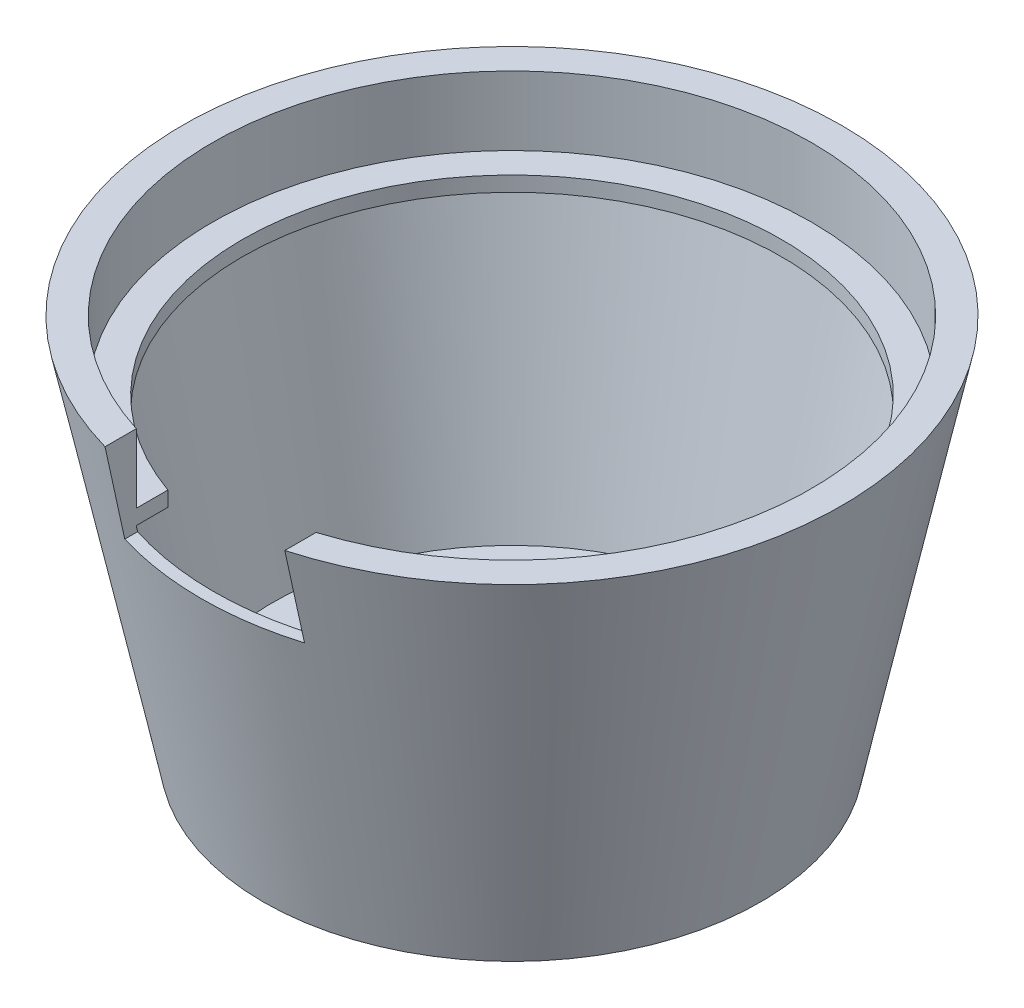
ISO-10303-21;
HEADER;
FILE_DESCRIPTION(('STEP AP214'),'2;1');
FILE_NAME('part.step','',(''),(''),'','','');
FILE_SCHEMA(('AUTOMOTIVE_DESIGN { 1 0 10303 214 1 1 1 1 }'));
ENDSEC;
DATA;
#1=APPLICATION_CONTEXT('core data for automotive mechanical design processes');
#2=APPLICATION_PROTOCOL_DEFINITION('international standard','automotive_design',2000,#1);
#3=PRODUCT_CONTEXT('',#1,'mechanical');
#4=PRODUCT('Part','Part','',(#3));
#5=PRODUCT_RELATED_PRODUCT_CATEGORY('part','',(#4));
#6=PRODUCT_DEFINITION_FORMATION('','',#4);
#7=PRODUCT_DEFINITION_CONTEXT('part definition',#1,'design');
#8=PRODUCT_DEFINITION('design','',#6,#7);
#9=PRODUCT_DEFINITION_SHAPE('','',#8);
#10=(LENGTH_UNIT() NAMED_UNIT(*) SI_UNIT(.MILLI.,.METRE.));
#11=(NAMED_UNIT(*) PLANE_ANGLE_UNIT() SI_UNIT($,.RADIAN.));
#12=(NAMED_UNIT(*) SI_UNIT($,.STERADIAN.) SOLID_ANGLE_UNIT());
#13=UNCERTAINTY_MEASURE_WITH_UNIT(LENGTH_MEASURE(1.E-05),#10,'distance_accuracy_value','');
#14=(GEOMETRIC_REPRESENTATION_CONTEXT(3) GLOBAL_UNCERTAINTY_ASSIGNED_CONTEXT((#13)) GLOBAL_UNIT_ASSIGNED_CONTEXT((#10,
#11,#12)) REPRESENTATION_CONTEXT('',''));
#15=CARTESIAN_POINT('',(0.,0.,0.));
#16=DIRECTION('',(0.,0.,1.));
#17=DIRECTION('',(1.,0.,0.));
#18=AXIS2_PLACEMENT_3D('',#15,#16,#17);
#19=CARTESIAN_POINT('',(0.,0.,0.));
#20=DIRECTION('',(0.,1.,0.));
#21=DIRECTION('',(0.,0.,1.));
#22=AXIS2_PLACEMENT_3D('',#19,#20,#21);
#23=PLANE('',#22);
#24=CARTESIAN_POINT('',(0.,0.,0.));
#25=DIRECTION('',(0.,1.,0.));
#26=DIRECTION('',(0.,0.,1.));
#27=AXIS2_PLACEMENT_3D('',#24,#25,#26);
#28=CIRCLE('',#27,83.0344571751672);
#29=CARTESIAN_POINT('',(0.,0.,83.0344571751672));
#30=VERTEX_POINT('',#29);
#31=EDGE_CURVE('E108',#30,#30,#28,.T.);
#32=ORIENTED_EDGE('',*,*,#31,.F.);
#33=EDGE_LOOP('',(#32));
#34=FACE_BOUND('',#33,.T.);
#35=ADVANCED_FACE('F33',(#34),#23,.F.);
#36=CARTESIAN_POINT('',(0.,0.,0.));
#37=DIRECTION('',(0.,1.,0.));
#38=DIRECTION('',(0.,0.,1.));
#39=AXIS2_PLACEMENT_3D('',#36,#37,#38);
#40=CONICAL_SURFACE('',#39,83.0344571751672,0.207632184076368);
#41=CARTESIAN_POINT('',(0.,98.,0.));
#42=DIRECTION('',(0.,1.,0.));
#43=DIRECTION('',(0.,0.,1.));
#44=AXIS2_PLACEMENT_3D('',#41,#42,#43);
#45=CIRCLE('',#44,103.67995090043);
#46=CARTESIAN_POINT('',(-30.,98.,99.2448095303504));
#47=VERTEX_POINT('',#46);
#48=CARTESIAN_POINT('',(30.,98.,99.2448095303504));
#49=VERTEX_POINT('',#48);
#50=EDGE_CURVE('E201',#47,#49,#45,.T.);
#51=ORIENTED_EDGE('',*,*,#50,.F.);
#52=CARTESIAN_POINT('',(-30.,11.1467842911483,79.9387941229223));
#53=CARTESIAN_POINT('',(-30.,15.0234413229523,80.8110948281733));
#54=CARTESIAN_POINT('',(-30.,18.9004729747379,81.6817290717428));
#55=CARTESIAN_POINT('',(-30.,26.6552200028053,83.4199451865092));
#56=CARTESIAN_POINT('',(-30.,30.5329353790032,84.2875270580805));
#57=CARTESIAN_POINT('',(-30.,42.1670052918576,86.8861141545615));
#58=CARTESIAN_POINT('',(-30.,49.9242885667875,88.6129619752041));
#59=CARTESIAN_POINT('',(-30.,65.4408911336463,92.0573601411311));
#60=CARTESIAN_POINT('',(-30.,73.2002104187839,93.774910517025));
#61=CARTESIAN_POINT('',(-30.,88.7205901537062,97.2021311658331));
#62=CARTESIAN_POINT('',(-30.,96.4816506037949,98.9118014373709));
#63=CARTESIAN_POINT('',(-30.,112.005238018175,102.32439643821));
#64=CARTESIAN_POINT('',(-30.,119.767764979545,104.0273211808));
#65=CARTESIAN_POINT('',(-30.,135.294092604152,107.427352063947));
#66=CARTESIAN_POINT('',(-30.,143.057893267344,109.124458204706));
#67=CARTESIAN_POINT('',(-30.,158.586623026695,112.513624846633));
#68=CARTESIAN_POINT('',(-30.,166.351552126569,114.205685330773));
#69=CARTESIAN_POINT('',(-30.,181.882375979694,117.585365611172));
#70=CARTESIAN_POINT('',(-30.,189.648270732854,119.272985407841));
#71=CARTESIAN_POINT('',(-30.,197.414580721871,120.958690365785));
#72=B_SPLINE_CURVE_WITH_KNOTS('',3,(#52,#53,#54,#55,#56,#57,#58,#59,#60,#61,#62,#63,#64,#65,#66,
#67,#68,#69,#70,#71),.UNSPECIFIED.,.F.,.F.,(4,2,2,2,2,2,2,2,2,4),(0.,11.9207542680957,
23.8415070742664,47.6829974534868,71.5244092927286,95.3658252963549,119.207194307158,
143.048562487092,166.890011030567,190.731457373112),.UNSPECIFIED.);
#73=CARTESIAN_POINT('',(-30.,128.,105.830052442584));
#74=VERTEX_POINT('',#73);
#75=EDGE_CURVE('E113',#47,#74,#72,.T.);
#76=ORIENTED_EDGE('',*,*,#75,.T.);
#77=CARTESIAN_POINT('',(0.,128.,0.));
#78=DIRECTION('',(0.,1.,0.));
#79=DIRECTION('',(0.,0.,1.));
#80=AXIS2_PLACEMENT_3D('',#77,#78,#79);
#81=CIRCLE('',#80,110.);
#82=CARTESIAN_POINT('',(30.,128.,105.830052442584));
#83=VERTEX_POINT('',#82);
#84=EDGE_CURVE('E141',#83,#74,#81,.T.);
#85=ORIENTED_EDGE('',*,*,#84,.F.);
#86=CARTESIAN_POINT('',(30.,197.414580721871,120.958690365785));
#87=CARTESIAN_POINT('',(30.,189.648270732854,119.272985407841));
#88=CARTESIAN_POINT('',(30.,181.882375979694,117.585365611172));
#89=CARTESIAN_POINT('',(30.,166.351552126569,114.205685330773));
#90=CARTESIAN_POINT('',(30.,158.586623026695,112.513624846633));
#91=CARTESIAN_POINT('',(30.,143.057893267344,109.124458204706));
#92=CARTESIAN_POINT('',(30.,135.294092604152,107.427352063947));
#93=CARTESIAN_POINT('',(30.,119.767764979545,104.0273211808));
#94=CARTESIAN_POINT('',(30.,112.005238018175,102.32439643821));
#95=CARTESIAN_POINT('',(30.,96.4816506037949,98.9118014373709));
#96=CARTESIAN_POINT('',(30.,88.7205901537062,97.2021311658331));
#97=CARTESIAN_POINT('',(30.,73.2002104187839,93.774910517025));
#98=CARTESIAN_POINT('',(30.,65.4408911336463,92.0573601411311));
#99=CARTESIAN_POINT('',(30.,49.9242885667875,88.6129619752041));
#100=CARTESIAN_POINT('',(30.,42.1670052918576,86.8861141545615));
#101=CARTESIAN_POINT('',(30.,30.5329353790032,84.2875270580805));
#102=CARTESIAN_POINT('',(30.,26.6552200028053,83.4199451865092));
#103=CARTESIAN_POINT('',(30.,18.9004729747379,81.6817290717428));
#104=CARTESIAN_POINT('',(30.,15.0234413229523,80.8110948281733));
#105=CARTESIAN_POINT('',(30.,11.1467842911483,79.9387941229223));
#106=B_SPLINE_CURVE_WITH_KNOTS('',3,(#86,#87,#88,#89,#90,#91,#92,#93,#94,#95,#96,#97,#98,#99,
#100,#101,#102,#103,#104,#105),.UNSPECIFIED.,.F.,.F.,(4,2,2,2,2,2,2,2,2,4),(0.,23.8414463425452,
47.6828948860206,71.5242630659545,95.3656320767573,119.207048080384,143.048459919625,
166.889950298846,178.810703105017,190.731457373112),.UNSPECIFIED.);
#107=EDGE_CURVE('E160',#83,#49,#106,.T.);
#108=ORIENTED_EDGE('',*,*,#107,.T.);
#109=EDGE_LOOP('',(#51,#76,#85,#108));
#110=FACE_BOUND('',#109,.T.);
#111=ORIENTED_EDGE('',*,*,#31,.T.);
#112=EDGE_LOOP('',(#111));
#113=FACE_BOUND('',#112,.T.);
#114=ADVANCED_FACE('F171',(#110,#113),#40,.T.);
#115=CARTESIAN_POINT('',(0.,128.,-110.));
#116=DIRECTION('',(0.,-1.,0.));
#117=DIRECTION('',(0.,0.,-1.));
#118=AXIS2_PLACEMENT_3D('',#115,#116,#117);
#119=PLANE('',#118);
#120=ORIENTED_EDGE('',*,*,#84,.T.);
#121=DIRECTION('',(0.,0.,1.));
#122=VECTOR('',#121,1.);
#123=CARTESIAN_POINT('',(-30.,128.,69.8146177251522));
#124=LINE('',#123,#122);
#125=CARTESIAN_POINT('',(-30.,128.,95.3939201416945));
#126=VERTEX_POINT('',#125);
#127=EDGE_CURVE('E206',#126,#74,#124,.T.);
#128=ORIENTED_EDGE('',*,*,#127,.F.);
#129=CARTESIAN_POINT('',(0.,128.,0.));
#130=DIRECTION('',(0.,1.,0.));
#131=DIRECTION('',(0.,0.,1.));
#132=AXIS2_PLACEMENT_3D('',#129,#130,#131);
#133=CIRCLE('',#132,100.);
#134=CARTESIAN_POINT('',(30.,128.,95.3939201416945));
#135=VERTEX_POINT('',#134);
#136=EDGE_CURVE('E138',#135,#126,#133,.T.);
#137=ORIENTED_EDGE('',*,*,#136,.F.);
#138=DIRECTION('',(0.,0.,-1.));
#139=VECTOR('',#138,1.);
#140=CARTESIAN_POINT('',(30.,128.,69.8146177251521));
#141=LINE('',#140,#139);
#142=EDGE_CURVE('E114',#83,#135,#141,.T.);
#143=ORIENTED_EDGE('',*,*,#142,.F.);
#144=EDGE_LOOP('',(#120,#128,#137,#143));
#145=FACE_BOUND('',#144,.T.);
#146=ADVANCED_FACE('F175',(#145),#119,.F.);
#147=CARTESIAN_POINT('',(0.,4.99999999999999,0.));
#148=DIRECTION('',(0.,1.,0.));
#149=DIRECTION('',(0.,0.,1.));
#150=AXIS2_PLACEMENT_3D('',#147,#148,#149);
#151=CYLINDRICAL_SURFACE('',#150,100.);
#152=ORIENTED_EDGE('',*,*,#136,.T.);
#153=DIRECTION('',(0.,1.,0.));
#154=VECTOR('',#153,1.);
#155=CARTESIAN_POINT('',(-30.,4.99999999999999,95.3939201416945));
#156=LINE('',#155,#154);
#157=CARTESIAN_POINT('',(-30.,105.,95.3939201416946));
#158=VERTEX_POINT('',#157);
#159=EDGE_CURVE('E183',#126,#158,#156,.F.);
#160=ORIENTED_EDGE('',*,*,#159,.T.);
#161=CARTESIAN_POINT('',(0.,105.,0.));
#162=DIRECTION('',(0.,1.,0.));
#163=DIRECTION('',(0.,0.,1.));
#164=AXIS2_PLACEMENT_3D('',#161,#162,#163);
#165=CIRCLE('',#164,100.);
#166=CARTESIAN_POINT('',(30.,105.,95.3939201416945));
#167=VERTEX_POINT('',#166);
#168=EDGE_CURVE('E135',#167,#158,#165,.T.);
#169=ORIENTED_EDGE('',*,*,#168,.F.);
#170=DIRECTION('',(0.,1.,0.));
#171=VECTOR('',#170,1.);
#172=CARTESIAN_POINT('',(30.,4.99999999999999,95.3939201416945));
#173=LINE('',#172,#171);
#174=EDGE_CURVE('E168',#167,#135,#173,.T.);
#175=ORIENTED_EDGE('',*,*,#174,.T.);
#176=EDGE_LOOP('',(#152,#160,#169,#175));
#177=FACE_BOUND('',#176,.T.);
#178=ADVANCED_FACE('F216',(#177),#151,.F.);
#179=CARTESIAN_POINT('',(0.,105.,-100.));
#180=DIRECTION('',(0.,-1.,0.));
#181=DIRECTION('',(0.,0.,-1.));
#182=AXIS2_PLACEMENT_3D('',#179,#180,#181);
#183=PLANE('',#182);
#184=ORIENTED_EDGE('',*,*,#168,.T.);
#185=DIRECTION('',(0.,0.,-1.));
#186=VECTOR('',#185,1.);
#187=CARTESIAN_POINT('',(-30.,105.,-100.));
#188=LINE('',#187,#186);
#189=CARTESIAN_POINT('',(-30.,105.,84.8528137423857));
#190=VERTEX_POINT('',#189);
#191=EDGE_CURVE('E60',#158,#190,#188,.T.);
#192=ORIENTED_EDGE('',*,*,#191,.T.);
#193=CARTESIAN_POINT('',(0.,105.,0.));
#194=DIRECTION('',(0.,1.,0.));
#195=DIRECTION('',(0.,0.,1.));
#196=AXIS2_PLACEMENT_3D('',#193,#194,#195);
#197=CIRCLE('',#196,90.);
#198=CARTESIAN_POINT('',(30.,105.,84.8528137423857));
#199=VERTEX_POINT('',#198);
#200=EDGE_CURVE('E127',#199,#190,#197,.T.);
#201=ORIENTED_EDGE('',*,*,#200,.F.);
#202=DIRECTION('',(0.,0.,1.));
#203=VECTOR('',#202,1.);
#204=CARTESIAN_POINT('',(30.,105.,-100.));
#205=LINE('',#204,#203);
#206=EDGE_CURVE('E198',#199,#167,#205,.T.);
#207=ORIENTED_EDGE('',*,*,#206,.T.);
#208=EDGE_LOOP('',(#184,#192,#201,#207));
#209=FACE_BOUND('',#208,.T.);
#210=ADVANCED_FACE('F192',(#209),#183,.F.);
#211=CARTESIAN_POINT('',(0.,4.99999999999999,0.));
#212=DIRECTION('',(0.,1.,0.));
#213=DIRECTION('',(0.,0.,1.));
#214=AXIS2_PLACEMENT_3D('',#211,#212,#213);
#215=CYLINDRICAL_SURFACE('',#214,90.);
#216=ORIENTED_EDGE('',*,*,#200,.T.);
#217=DIRECTION('',(0.,1.,0.));
#218=VECTOR('',#217,1.);
#219=CARTESIAN_POINT('',(-30.,4.99999999999999,84.8528137423857));
#220=LINE('',#219,#218);
#221=CARTESIAN_POINT('',(-30.,100.,84.8528137423857));
#222=VERTEX_POINT('',#221);
#223=EDGE_CURVE('E185',#190,#222,#220,.F.);
#224=ORIENTED_EDGE('',*,*,#223,.T.);
#225=CARTESIAN_POINT('',(0.,100.,0.));
#226=DIRECTION('',(0.,1.,0.));
#227=DIRECTION('',(0.,0.,1.));
#228=AXIS2_PLACEMENT_3D('',#225,#226,#227);
#229=CIRCLE('',#228,90.);
#230=CARTESIAN_POINT('',(30.,100.,84.8528137423857));
#231=VERTEX_POINT('',#230);
#232=EDGE_CURVE('E123',#231,#222,#229,.T.);
#233=ORIENTED_EDGE('',*,*,#232,.F.);
#234=DIRECTION('',(0.,1.,0.));
#235=VECTOR('',#234,1.);
#236=CARTESIAN_POINT('',(30.,4.99999999999999,84.8528137423857));
#237=LINE('',#236,#235);
#238=EDGE_CURVE('E197',#231,#199,#237,.T.);
#239=ORIENTED_EDGE('',*,*,#238,.T.);
#240=EDGE_LOOP('',(#216,#224,#233,#239));
#241=FACE_BOUND('',#240,.T.);
#242=ADVANCED_FACE('F196',(#241),#215,.F.);
#243=CARTESIAN_POINT('',(0.,100.,-90.));
#244=DIRECTION('',(0.,1.,0.));
#245=DIRECTION('',(0.,0.,1.));
#246=AXIS2_PLACEMENT_3D('',#243,#244,#245);
#247=PLANE('',#246);
#248=ORIENTED_EDGE('',*,*,#232,.T.);
#249=DIRECTION('',(0.,0.,1.));
#250=VECTOR('',#249,1.);
#251=CARTESIAN_POINT('',(-30.,100.,-90.));
#252=LINE('',#251,#250);
#253=CARTESIAN_POINT('',(-30.,100.,95.40806016794));
#254=VERTEX_POINT('',#253);
#255=EDGE_CURVE('E167',#222,#254,#252,.T.);
#256=ORIENTED_EDGE('',*,*,#255,.T.);
#257=CARTESIAN_POINT('',(0.,100.,0.));
#258=DIRECTION('',(0.,1.,0.));
#259=DIRECTION('',(0.,0.,1.));
#260=AXIS2_PLACEMENT_3D('',#257,#258,#259);
#261=CIRCLE('',#260,100.013488815306);
#262=CARTESIAN_POINT('',(30.,100.,95.40806016794));
#263=VERTEX_POINT('',#262);
#264=EDGE_CURVE('E120',#263,#254,#261,.T.);
#265=ORIENTED_EDGE('',*,*,#264,.F.);
#266=DIRECTION('',(0.,0.,-1.));
#267=VECTOR('',#266,1.);
#268=CARTESIAN_POINT('',(30.,100.,-90.));
#269=LINE('',#268,#267);
#270=EDGE_CURVE('E199',#263,#231,#269,.T.);
#271=ORIENTED_EDGE('',*,*,#270,.T.);
#272=EDGE_LOOP('',(#248,#256,#265,#271));
#273=FACE_BOUND('',#272,.T.);
#274=ADVANCED_FACE('F189',(#273),#247,.F.);
#275=CARTESIAN_POINT('',(0.,100.,0.));
#276=DIRECTION('',(0.,1.,0.));
#277=DIRECTION('',(0.,0.,1.));
#278=AXIS2_PLACEMENT_3D('',#275,#276,#277);
#279=CONICAL_SURFACE('',#278,100.013488815306,0.207632184076368);
#280=ORIENTED_EDGE('',*,*,#264,.T.);
#281=CARTESIAN_POINT('',(-30.,152.63464438587,106.974955393835));
#282=CARTESIAN_POINT('',(-30.,148.182612037331,106.000867513595));
#283=CARTESIAN_POINT('',(-30.,143.730781135998,105.025858943575));
#284=CARTESIAN_POINT('',(-30.,134.827560480691,103.073828829783));
#285=CARTESIAN_POINT('',(-30.,130.376170726737,102.096807285921));
#286=CARTESIAN_POINT('',(-30.,117.022734380547,99.1624688376071));
#287=CARTESIAN_POINT('',(-30.,108.121407488438,97.2018752259873));
#288=CARTESIAN_POINT('',(-30.,90.3210526803226,93.2702540530904));
#289=CARTESIAN_POINT('',(-30.,81.4220247654336,91.299226486754));
#290=CARTESIAN_POINT('',(-30.,68.075583613864,88.3332028268479));
#291=CARTESIAN_POINT('',(-30.,63.6271167819767,87.3429471647687));
#292=CARTESIAN_POINT('',(-30.,54.7309658286493,85.3589237771409));
#293=CARTESIAN_POINT('',(-30.,50.28328170731,84.3651560511408));
#294=CARTESIAN_POINT('',(-30.,45.8360296684306,83.3694565386039));
#295=B_SPLINE_CURVE_WITH_KNOTS('',3,(#281,#282,#283,#284,#285,#286,#287,#288,#289,#290,#291,
#292,#293,#294),.UNSPECIFIED.,.F.,.F.,(4,2,2,2,2,2,4),(0.,13.6720499193966,27.3441004555575,
54.6881609440565,82.032234692324,95.7042914551912,109.376349975174),.UNSPECIFIED.);
#296=CARTESIAN_POINT('',(-30.,98.,94.9662928704412));
#297=VERTEX_POINT('',#296);
#298=EDGE_CURVE('E11',#254,#297,#295,.T.);
#299=ORIENTED_EDGE('',*,*,#298,.T.);
#300=CARTESIAN_POINT('',(0.,98.,0.));
#301=DIRECTION('',(0.,1.,0.));
#302=DIRECTION('',(0.,0.,1.));
#303=AXIS2_PLACEMENT_3D('',#300,#301,#302);
#304=CIRCLE('',#303,99.5921522086676);
#305=CARTESIAN_POINT('',(30.,98.,94.9662928704412));
#306=VERTEX_POINT('',#305);
#307=EDGE_CURVE('E101',#306,#297,#304,.F.);
#308=ORIENTED_EDGE('',*,*,#307,.F.);
#309=CARTESIAN_POINT('',(30.,45.8360296684305,83.3694565386039));
#310=CARTESIAN_POINT('',(30.,50.28328170731,84.3651560511407));
#311=CARTESIAN_POINT('',(30.,54.7309658286493,85.3589237771409));
#312=CARTESIAN_POINT('',(30.,63.6271167819766,87.3429471647688));
#313=CARTESIAN_POINT('',(30.,68.075583613864,88.3332028268479));
#314=CARTESIAN_POINT('',(30.,81.4220247654336,91.2992264867541));
#315=CARTESIAN_POINT('',(30.,90.3210526803226,93.2702540530904));
#316=CARTESIAN_POINT('',(30.,108.121407488438,97.2018752259874));
#317=CARTESIAN_POINT('',(30.,117.022734380547,99.162468837607));
#318=CARTESIAN_POINT('',(30.,130.376170726737,102.096807285921));
#319=CARTESIAN_POINT('',(30.,134.827560480691,103.073828829783));
#320=CARTESIAN_POINT('',(30.,143.730781135998,105.025858943575));
#321=CARTESIAN_POINT('',(30.,148.182612037331,106.000867513595));
#322=CARTESIAN_POINT('',(30.,152.63464438587,106.974955393835));
#323=B_SPLINE_CURVE_WITH_KNOTS('',3,(#309,#310,#311,#312,#313,#314,#315,#316,#317,#318,#319,
#320,#321,#322),.UNSPECIFIED.,.F.,.F.,(4,2,2,2,2,2,4),(0.,13.6720585199825,27.3441152828497,
54.6881890311173,82.0322495196163,95.7043000557772,109.376349975174),.UNSPECIFIED.);
#324=EDGE_CURVE('E45',#306,#263,#323,.T.);
#325=ORIENTED_EDGE('',*,*,#324,.T.);
#326=EDGE_LOOP('',(#280,#299,#308,#325));
#327=FACE_BOUND('',#326,.T.);
#328=CARTESIAN_POINT('',(0.,5.,0.));
#329=DIRECTION('',(0.,1.,0.));
#330=DIRECTION('',(0.,0.,1.));
#331=AXIS2_PLACEMENT_3D('',#328,#329,#330);
#332=CIRCLE('',#331,80.);
#333=CARTESIAN_POINT('',(0.,5.00000000000001,80.));
#334=VERTEX_POINT('',#333);
#335=EDGE_CURVE('E124',#334,#334,#332,.T.);
#336=ORIENTED_EDGE('',*,*,#335,.F.);
#337=EDGE_LOOP('',(#336));
#338=FACE_BOUND('',#337,.T.);
#339=ADVANCED_FACE('F117',(#327,#338),#279,.F.);
#340=CARTESIAN_POINT('',(0.,4.99999999999999,-80.));
#341=DIRECTION('',(0.,-1.,0.));
#342=DIRECTION('',(0.,0.,-1.));
#343=AXIS2_PLACEMENT_3D('',#340,#341,#342);
#344=PLANE('',#343);
#345=ORIENTED_EDGE('',*,*,#335,.T.);
#346=EDGE_LOOP('',(#345));
#347=FACE_BOUND('',#346,.T.);
#348=ADVANCED_FACE('F271',(#347),#344,.F.);
#349=CARTESIAN_POINT('',(-30.,98.,69.8146177251522));
#350=DIRECTION('',(-1.,0.,0.));
#351=DIRECTION('',(0.,0.,1.));
#352=AXIS2_PLACEMENT_3D('',#349,#350,#351);
#353=PLANE('',#352);
#354=DIRECTION('',(0.,0.,1.));
#355=VECTOR('',#354,1.);
#356=CARTESIAN_POINT('',(-30.,98.,69.8146177251522));
#357=LINE('',#356,#355);
#358=EDGE_CURVE('E104',#297,#47,#357,.T.);
#359=ORIENTED_EDGE('',*,*,#358,.F.);
#360=ORIENTED_EDGE('',*,*,#298,.F.);
#361=ORIENTED_EDGE('',*,*,#255,.F.);
#362=ORIENTED_EDGE('',*,*,#223,.F.);
#363=ORIENTED_EDGE('',*,*,#191,.F.);
#364=ORIENTED_EDGE('',*,*,#159,.F.);
#365=ORIENTED_EDGE('',*,*,#127,.T.);
#366=ORIENTED_EDGE('',*,*,#75,.F.);
#367=EDGE_LOOP('',(#359,#360,#361,#362,#363,#364,#365,#366));
#368=FACE_BOUND('',#367,.T.);
#369=ADVANCED_FACE('F110',(#368),#353,.F.);
#370=CARTESIAN_POINT('',(30.,98.,69.8146177251521));
#371=DIRECTION('',(1.,0.,0.));
#372=DIRECTION('',(0.,0.,-1.));
#373=AXIS2_PLACEMENT_3D('',#370,#371,#372);
#374=PLANE('',#373);
#375=ORIENTED_EDGE('',*,*,#142,.T.);
#376=ORIENTED_EDGE('',*,*,#174,.F.);
#377=ORIENTED_EDGE('',*,*,#206,.F.);
#378=ORIENTED_EDGE('',*,*,#238,.F.);
#379=ORIENTED_EDGE('',*,*,#270,.F.);
#380=ORIENTED_EDGE('',*,*,#324,.F.);
#381=DIRECTION('',(0.,0.,-1.));
#382=VECTOR('',#381,1.);
#383=CARTESIAN_POINT('',(30.,98.,69.8146177251521));
#384=LINE('',#383,#382);
#385=EDGE_CURVE('E52',#49,#306,#384,.T.);
#386=ORIENTED_EDGE('',*,*,#385,.F.);
#387=ORIENTED_EDGE('',*,*,#107,.F.);
#388=EDGE_LOOP('',(#375,#376,#377,#378,#379,#380,#386,#387));
#389=FACE_BOUND('',#388,.T.);
#390=ADVANCED_FACE('F152',(#389),#374,.F.);
#391=CARTESIAN_POINT('',(0.,98.,0.));
#392=DIRECTION('',(0.,1.,0.));
#393=DIRECTION('',(0.,0.,1.));
#394=AXIS2_PLACEMENT_3D('',#391,#392,#393);
#395=PLANE('',#394);
#396=ORIENTED_EDGE('',*,*,#50,.T.);
#397=ORIENTED_EDGE('',*,*,#385,.T.);
#398=ORIENTED_EDGE('',*,*,#307,.T.);
#399=ORIENTED_EDGE('',*,*,#358,.T.);
#400=EDGE_LOOP('',(#396,#397,#398,#399));
#401=FACE_BOUND('',#400,.T.);
#402=ADVANCED_FACE('F103',(#401),#395,.T.);
#403=CLOSED_SHELL('',(#35,#114,#146,#178,#210,#242,#274,#339,#348,#369,#390,#402));
#404=MANIFOLD_SOLID_BREP('B2',#403);
#405=ADVANCED_BREP_SHAPE_REPRESENTATION('',(#18,#404),#14);
#406=SHAPE_DEFINITION_REPRESENTATION(#9,#405);
ENDSEC;
END-ISO-10303-21;
